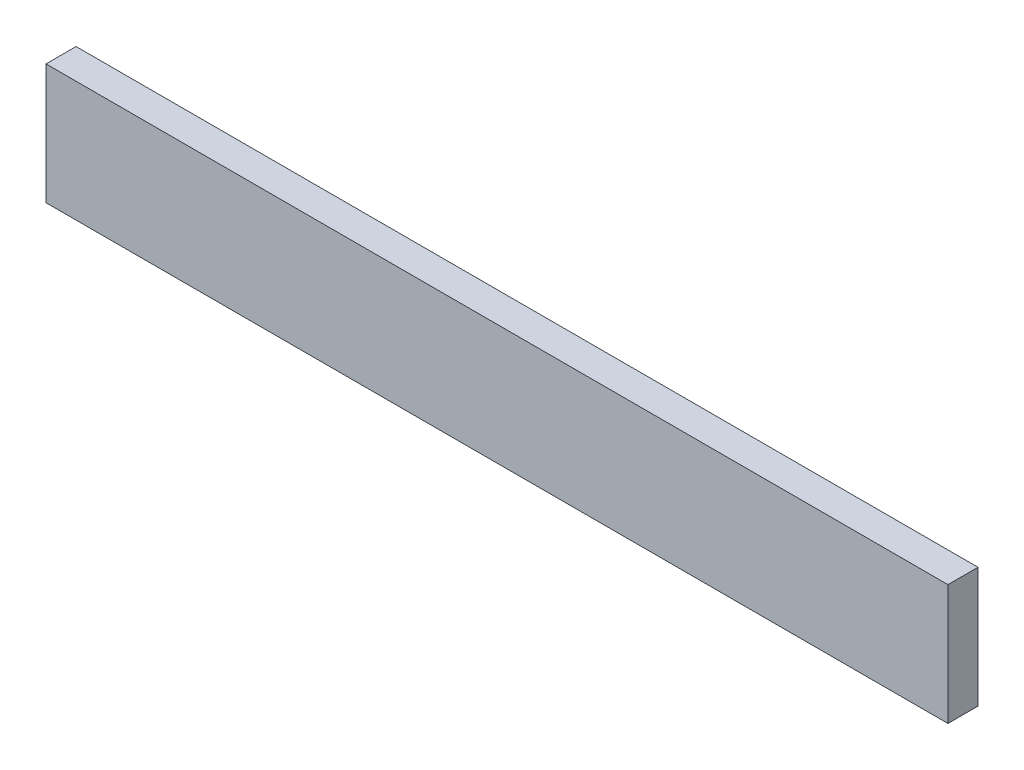
ISO-10303-21;
HEADER;
FILE_DESCRIPTION(('STEP AP214'),'2;1');
FILE_NAME('part.step','',(''),(''),'','','');
FILE_SCHEMA(('AUTOMOTIVE_DESIGN { 1 0 10303 214 1 1 1 1 }'));
ENDSEC;
DATA;
#1=APPLICATION_CONTEXT('core data for automotive mechanical design processes');
#2=APPLICATION_PROTOCOL_DEFINITION('international standard','automotive_design',2000,#1);
#3=PRODUCT_CONTEXT('',#1,'mechanical');
#4=PRODUCT('Part','Part','',(#3));
#5=PRODUCT_RELATED_PRODUCT_CATEGORY('part','',(#4));
#6=PRODUCT_DEFINITION_FORMATION('','',#4);
#7=PRODUCT_DEFINITION_CONTEXT('part definition',#1,'design');
#8=PRODUCT_DEFINITION('design','',#6,#7);
#9=PRODUCT_DEFINITION_SHAPE('','',#8);
#10=(LENGTH_UNIT() NAMED_UNIT(*) SI_UNIT(.MILLI.,.METRE.));
#11=(NAMED_UNIT(*) PLANE_ANGLE_UNIT() SI_UNIT($,.RADIAN.));
#12=(NAMED_UNIT(*) SI_UNIT($,.STERADIAN.) SOLID_ANGLE_UNIT());
#13=UNCERTAINTY_MEASURE_WITH_UNIT(LENGTH_MEASURE(1.E-05),#10,'distance_accuracy_value','');
#14=(GEOMETRIC_REPRESENTATION_CONTEXT(3) GLOBAL_UNCERTAINTY_ASSIGNED_CONTEXT((#13)) GLOBAL_UNIT_ASSIGNED_CONTEXT((#10,
#11,#12)) REPRESENTATION_CONTEXT('',''));
#15=CARTESIAN_POINT('',(0.,0.,0.));
#16=DIRECTION('',(0.,0.,1.));
#17=DIRECTION('',(1.,0.,0.));
#18=AXIS2_PLACEMENT_3D('',#15,#16,#17);
#19=CARTESIAN_POINT('',(-30.,4.,1.));
#20=DIRECTION('',(1.,0.,0.));
#21=DIRECTION('',(0.,0.,-1.));
#22=AXIS2_PLACEMENT_3D('',#19,#20,#21);
#23=PLANE('',#22);
#24=DIRECTION('',(0.,-1.,0.));
#25=VECTOR('',#24,1.);
#26=CARTESIAN_POINT('',(-30.,4.,-1.));
#27=LINE('',#26,#25);
#28=CARTESIAN_POINT('',(-30.,4.,-1.));
#29=VERTEX_POINT('',#28);
#30=CARTESIAN_POINT('',(-30.,-4.,-1.));
#31=VERTEX_POINT('',#30);
#32=EDGE_CURVE('E98',#29,#31,#27,.T.);
#33=ORIENTED_EDGE('',*,*,#32,.T.);
#34=DIRECTION('',(0.,0.,-1.));
#35=VECTOR('',#34,1.);
#36=CARTESIAN_POINT('',(-30.,-4.,1.));
#37=LINE('',#36,#35);
#38=CARTESIAN_POINT('',(-30.,-4.,1.));
#39=VERTEX_POINT('',#38);
#40=EDGE_CURVE('E11',#39,#31,#37,.T.);
#41=ORIENTED_EDGE('',*,*,#40,.F.);
#42=DIRECTION('',(0.,-1.,0.));
#43=VECTOR('',#42,1.);
#44=CARTESIAN_POINT('',(-30.,4.,1.));
#45=LINE('',#44,#43);
#46=CARTESIAN_POINT('',(-30.,4.,1.));
#47=VERTEX_POINT('',#46);
#48=EDGE_CURVE('E86',#47,#39,#45,.T.);
#49=ORIENTED_EDGE('',*,*,#48,.F.);
#50=DIRECTION('',(0.,0.,-1.));
#51=VECTOR('',#50,1.);
#52=CARTESIAN_POINT('',(-30.,4.,1.));
#53=LINE('',#52,#51);
#54=EDGE_CURVE('E94',#47,#29,#53,.T.);
#55=ORIENTED_EDGE('',*,*,#54,.T.);
#56=EDGE_LOOP('',(#33,#41,#49,#55));
#57=FACE_BOUND('',#56,.T.);
#58=ADVANCED_FACE('F35',(#57),#23,.F.);
#59=CARTESIAN_POINT('',(30.,-4.,1.));
#60=DIRECTION('',(0.,1.,0.));
#61=DIRECTION('',(0.,0.,1.));
#62=AXIS2_PLACEMENT_3D('',#59,#60,#61);
#63=PLANE('',#62);
#64=DIRECTION('',(1.,0.,0.));
#65=VECTOR('',#64,1.);
#66=CARTESIAN_POINT('',(30.,-4.,-1.));
#67=LINE('',#66,#65);
#68=CARTESIAN_POINT('',(30.,-4.,-1.));
#69=VERTEX_POINT('',#68);
#70=EDGE_CURVE('E90',#31,#69,#67,.T.);
#71=ORIENTED_EDGE('',*,*,#70,.T.);
#72=DIRECTION('',(0.,0.,-1.));
#73=VECTOR('',#72,1.);
#74=CARTESIAN_POINT('',(30.,-4.,1.));
#75=LINE('',#74,#73);
#76=CARTESIAN_POINT('',(30.,-4.,1.));
#77=VERTEX_POINT('',#76);
#78=EDGE_CURVE('E43',#77,#69,#75,.T.);
#79=ORIENTED_EDGE('',*,*,#78,.F.);
#80=DIRECTION('',(1.,0.,0.));
#81=VECTOR('',#80,1.);
#82=CARTESIAN_POINT('',(30.,-4.,1.));
#83=LINE('',#82,#81);
#84=EDGE_CURVE('E81',#39,#77,#83,.T.);
#85=ORIENTED_EDGE('',*,*,#84,.F.);
#86=ORIENTED_EDGE('',*,*,#40,.T.);
#87=EDGE_LOOP('',(#71,#79,#85,#86));
#88=FACE_BOUND('',#87,.T.);
#89=ADVANCED_FACE('F89',(#88),#63,.F.);
#90=CARTESIAN_POINT('',(30.,4.,1.));
#91=DIRECTION('',(-1.,0.,0.));
#92=DIRECTION('',(0.,0.,1.));
#93=AXIS2_PLACEMENT_3D('',#90,#91,#92);
#94=PLANE('',#93);
#95=DIRECTION('',(0.,1.,0.));
#96=VECTOR('',#95,1.);
#97=CARTESIAN_POINT('',(30.,4.,-1.));
#98=LINE('',#97,#96);
#99=CARTESIAN_POINT('',(30.,4.,-1.));
#100=VERTEX_POINT('',#99);
#101=EDGE_CURVE('E68',#69,#100,#98,.T.);
#102=ORIENTED_EDGE('',*,*,#101,.T.);
#103=DIRECTION('',(0.,0.,-1.));
#104=VECTOR('',#103,1.);
#105=CARTESIAN_POINT('',(30.,4.,1.));
#106=LINE('',#105,#104);
#107=CARTESIAN_POINT('',(30.,4.,1.));
#108=VERTEX_POINT('',#107);
#109=EDGE_CURVE('E91',#108,#100,#106,.T.);
#110=ORIENTED_EDGE('',*,*,#109,.F.);
#111=DIRECTION('',(0.,1.,0.));
#112=VECTOR('',#111,1.);
#113=CARTESIAN_POINT('',(30.,4.,1.));
#114=LINE('',#113,#112);
#115=EDGE_CURVE('E84',#77,#108,#114,.T.);
#116=ORIENTED_EDGE('',*,*,#115,.F.);
#117=ORIENTED_EDGE('',*,*,#78,.T.);
#118=EDGE_LOOP('',(#102,#110,#116,#117));
#119=FACE_BOUND('',#118,.T.);
#120=ADVANCED_FACE('F92',(#119),#94,.F.);
#121=CARTESIAN_POINT('',(30.,4.,1.));
#122=DIRECTION('',(0.,-1.,0.));
#123=DIRECTION('',(0.,0.,-1.));
#124=AXIS2_PLACEMENT_3D('',#121,#122,#123);
#125=PLANE('',#124);
#126=DIRECTION('',(-1.,0.,0.));
#127=VECTOR('',#126,1.);
#128=CARTESIAN_POINT('',(30.,4.,-1.));
#129=LINE('',#128,#127);
#130=EDGE_CURVE('E74',#100,#29,#129,.T.);
#131=ORIENTED_EDGE('',*,*,#130,.T.);
#132=ORIENTED_EDGE('',*,*,#54,.F.);
#133=DIRECTION('',(-1.,0.,0.));
#134=VECTOR('',#133,1.);
#135=CARTESIAN_POINT('',(30.,4.,1.));
#136=LINE('',#135,#134);
#137=EDGE_CURVE('E51',#108,#47,#136,.T.);
#138=ORIENTED_EDGE('',*,*,#137,.F.);
#139=ORIENTED_EDGE('',*,*,#109,.T.);
#140=EDGE_LOOP('',(#131,#132,#138,#139));
#141=FACE_BOUND('',#140,.T.);
#142=ADVANCED_FACE('F105',(#141),#125,.F.);
#143=CARTESIAN_POINT('',(0.,0.,1.));
#144=DIRECTION('',(0.,0.,-1.));
#145=DIRECTION('',(-1.,0.,0.));
#146=AXIS2_PLACEMENT_3D('',#143,#144,#145);
#147=PLANE('',#146);
#148=ORIENTED_EDGE('',*,*,#48,.T.);
#149=ORIENTED_EDGE('',*,*,#84,.T.);
#150=ORIENTED_EDGE('',*,*,#115,.T.);
#151=ORIENTED_EDGE('',*,*,#137,.T.);
#152=EDGE_LOOP('',(#148,#149,#150,#151));
#153=FACE_BOUND('',#152,.T.);
#154=ADVANCED_FACE('F82',(#153),#147,.F.);
#155=CARTESIAN_POINT('',(0.,0.,-1.));
#156=DIRECTION('',(0.,0.,-1.));
#157=DIRECTION('',(-1.,0.,0.));
#158=AXIS2_PLACEMENT_3D('',#155,#156,#157);
#159=PLANE('',#158);
#160=ORIENTED_EDGE('',*,*,#32,.F.);
#161=ORIENTED_EDGE('',*,*,#130,.F.);
#162=ORIENTED_EDGE('',*,*,#101,.F.);
#163=ORIENTED_EDGE('',*,*,#70,.F.);
#164=EDGE_LOOP('',(#160,#161,#162,#163));
#165=FACE_BOUND('',#164,.T.);
#166=ADVANCED_FACE('F108',(#165),#159,.T.);
#167=CLOSED_SHELL('',(#58,#89,#120,#142,#154,#166));
#168=MANIFOLD_SOLID_BREP('B2',#167);
#169=ADVANCED_BREP_SHAPE_REPRESENTATION('',(#18,#168),#14);
#170=SHAPE_DEFINITION_REPRESENTATION(#9,#169);
ENDSEC;
END-ISO-10303-21;
